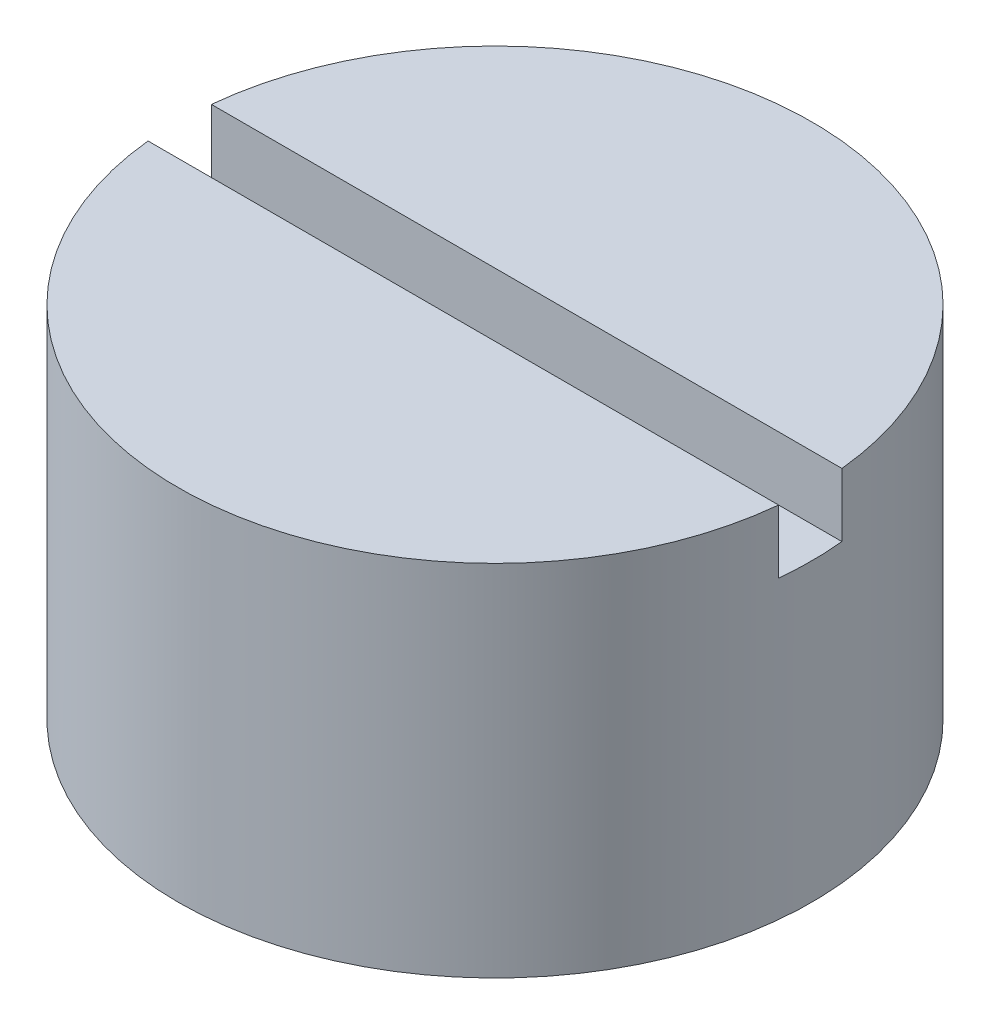
ISO-10303-21;
HEADER;
FILE_DESCRIPTION(('STEP AP214'),'2;1');
FILE_NAME('part.step','',(''),(''),'','','');
FILE_SCHEMA(('AUTOMOTIVE_DESIGN { 1 0 10303 214 1 1 1 1 }'));
ENDSEC;
DATA;
#1=APPLICATION_CONTEXT('core data for automotive mechanical design processes');
#2=APPLICATION_PROTOCOL_DEFINITION('international standard','automotive_design',2000,#1);
#3=PRODUCT_CONTEXT('',#1,'mechanical');
#4=PRODUCT('Part','Part','',(#3));
#5=PRODUCT_RELATED_PRODUCT_CATEGORY('part','',(#4));
#6=PRODUCT_DEFINITION_FORMATION('','',#4);
#7=PRODUCT_DEFINITION_CONTEXT('part definition',#1,'design');
#8=PRODUCT_DEFINITION('design','',#6,#7);
#9=PRODUCT_DEFINITION_SHAPE('','',#8);
#10=(LENGTH_UNIT() NAMED_UNIT(*) SI_UNIT(.MILLI.,.METRE.));
#11=(NAMED_UNIT(*) PLANE_ANGLE_UNIT() SI_UNIT($,.RADIAN.));
#12=(NAMED_UNIT(*) SI_UNIT($,.STERADIAN.) SOLID_ANGLE_UNIT());
#13=UNCERTAINTY_MEASURE_WITH_UNIT(LENGTH_MEASURE(1.E-05),#10,'distance_accuracy_value','');
#14=(GEOMETRIC_REPRESENTATION_CONTEXT(3) GLOBAL_UNCERTAINTY_ASSIGNED_CONTEXT((#13)) GLOBAL_UNIT_ASSIGNED_CONTEXT((#10,
#11,#12)) REPRESENTATION_CONTEXT('',''));
#15=CARTESIAN_POINT('',(0.,0.,0.));
#16=DIRECTION('',(0.,0.,1.));
#17=DIRECTION('',(1.,0.,0.));
#18=AXIS2_PLACEMENT_3D('',#15,#16,#17);
#19=CARTESIAN_POINT('',(0.,11.,0.));
#20=DIRECTION('',(0.,1.,0.));
#21=DIRECTION('',(0.,0.,1.));
#22=AXIS2_PLACEMENT_3D('',#19,#20,#21);
#23=PLANE('',#22);
#24=DIRECTION('',(-1.,0.,0.));
#25=VECTOR('',#24,1.);
#26=CARTESIAN_POINT('',(0.,11.,-1.5));
#27=LINE('',#26,#25);
#28=CARTESIAN_POINT('',(14.9248115565993,11.,-1.5));
#29=VERTEX_POINT('',#28);
#30=CARTESIAN_POINT('',(-14.9248115565993,11.,-1.5));
#31=VERTEX_POINT('',#30);
#32=EDGE_CURVE('E117',#29,#31,#27,.T.);
#33=ORIENTED_EDGE('',*,*,#32,.F.);
#34=CARTESIAN_POINT('',(0.,11.,0.));
#35=DIRECTION('',(0.,1.,0.));
#36=DIRECTION('',(0.,0.,1.));
#37=AXIS2_PLACEMENT_3D('',#34,#35,#36);
#38=CIRCLE('',#37,15.);
#39=EDGE_CURVE('E129',#29,#31,#38,.T.);
#40=ORIENTED_EDGE('',*,*,#39,.T.);
#41=EDGE_LOOP('',(#33,#40));
#42=FACE_BOUND('',#41,.T.);
#43=ADVANCED_FACE('F33',(#42),#23,.T.);
#44=CARTESIAN_POINT('',(0.,-6.,0.));
#45=DIRECTION('',(0.,1.,0.));
#46=DIRECTION('',(0.,0.,1.));
#47=AXIS2_PLACEMENT_3D('',#44,#45,#46);
#48=PLANE('',#47);
#49=CARTESIAN_POINT('',(0.,-6.,0.));
#50=DIRECTION('',(0.,1.,0.));
#51=DIRECTION('',(0.,0.,1.));
#52=AXIS2_PLACEMENT_3D('',#49,#50,#51);
#53=CIRCLE('',#52,15.);
#54=CARTESIAN_POINT('',(0.,-6.,15.));
#55=VERTEX_POINT('',#54);
#56=EDGE_CURVE('E118',#55,#55,#53,.T.);
#57=ORIENTED_EDGE('',*,*,#56,.F.);
#58=EDGE_LOOP('',(#57));
#59=FACE_BOUND('',#58,.T.);
#60=DIRECTION('',(-0.866025403784439,0.,-0.5));
#61=VECTOR('',#60,1.);
#62=CARTESIAN_POINT('',(11.125,-6.,-6.42302174473459));
#63=LINE('',#62,#61);
#64=CARTESIAN_POINT('',(11.125,-6.,-6.42302174473459));
#65=VERTEX_POINT('',#64);
#66=CARTESIAN_POINT('',(0.,-6.,-12.8460434894692));
#67=VERTEX_POINT('',#66);
#68=EDGE_CURVE('E56',#65,#67,#63,.T.);
#69=ORIENTED_EDGE('',*,*,#68,.T.);
#70=DIRECTION('',(-0.866025403784439,0.,0.5));
#71=VECTOR('',#70,1.);
#72=CARTESIAN_POINT('',(0.,-6.,-12.8460434894692));
#73=LINE('',#72,#71);
#74=CARTESIAN_POINT('',(-11.125,-6.,-6.42302174473459));
#75=VERTEX_POINT('',#74);
#76=EDGE_CURVE('E158',#67,#75,#73,.T.);
#77=ORIENTED_EDGE('',*,*,#76,.T.);
#78=DIRECTION('',(0.,0.,1.));
#79=VECTOR('',#78,1.);
#80=CARTESIAN_POINT('',(-11.125,-6.,-6.42302174473459));
#81=LINE('',#80,#79);
#82=CARTESIAN_POINT('',(-11.125,-6.,6.42302174473458));
#83=VERTEX_POINT('',#82);
#84=EDGE_CURVE('E161',#75,#83,#81,.T.);
#85=ORIENTED_EDGE('',*,*,#84,.T.);
#86=DIRECTION('',(0.866025403784439,0.,0.5));
#87=VECTOR('',#86,1.);
#88=CARTESIAN_POINT('',(-11.125,-6.,6.42302174473458));
#89=LINE('',#88,#87);
#90=CARTESIAN_POINT('',(0.,-6.,12.8460434894692));
#91=VERTEX_POINT('',#90);
#92=EDGE_CURVE('E164',#83,#91,#89,.T.);
#93=ORIENTED_EDGE('',*,*,#92,.T.);
#94=DIRECTION('',(0.866025403784439,0.,-0.5));
#95=VECTOR('',#94,1.);
#96=CARTESIAN_POINT('',(0.,-6.,12.8460434894692));
#97=LINE('',#96,#95);
#98=CARTESIAN_POINT('',(11.125,-6.,6.42302174473459));
#99=VERTEX_POINT('',#98);
#100=EDGE_CURVE('E167',#91,#99,#97,.T.);
#101=ORIENTED_EDGE('',*,*,#100,.T.);
#102=DIRECTION('',(0.,0.,-1.));
#103=VECTOR('',#102,1.);
#104=CARTESIAN_POINT('',(11.125,-6.,6.42302174473459));
#105=LINE('',#104,#103);
#106=EDGE_CURVE('E141',#99,#65,#105,.T.);
#107=ORIENTED_EDGE('',*,*,#106,.T.);
#108=EDGE_LOOP('',(#69,#77,#85,#93,#101,#107));
#109=FACE_BOUND('',#108,.T.);
#110=ADVANCED_FACE('F198',(#59,#109),#48,.F.);
#111=CARTESIAN_POINT('',(0.,6.,0.));
#112=DIRECTION('',(0.,-1.,0.));
#113=DIRECTION('',(0.,0.,-1.));
#114=AXIS2_PLACEMENT_3D('',#111,#112,#113);
#115=CYLINDRICAL_SURFACE('',#114,15.);
#116=ORIENTED_EDGE('',*,*,#39,.F.);
#117=DIRECTION('',(0.,-1.,0.));
#118=VECTOR('',#117,1.);
#119=CARTESIAN_POINT('',(14.9248115565993,6.,-1.5));
#120=LINE('',#119,#118);
#121=CARTESIAN_POINT('',(14.9248115565993,8.,-1.5));
#122=VERTEX_POINT('',#121);
#123=EDGE_CURVE('E130',#29,#122,#120,.T.);
#124=ORIENTED_EDGE('',*,*,#123,.T.);
#125=CARTESIAN_POINT('',(0.,8.,0.));
#126=DIRECTION('',(0.,1.,0.));
#127=DIRECTION('',(0.,0.,1.));
#128=AXIS2_PLACEMENT_3D('',#125,#126,#127);
#129=CIRCLE('',#128,15.);
#130=CARTESIAN_POINT('',(14.9248115565993,8.,1.5));
#131=VERTEX_POINT('',#130);
#132=EDGE_CURVE('E11',#131,#122,#129,.T.);
#133=ORIENTED_EDGE('',*,*,#132,.F.);
#134=DIRECTION('',(0.,-1.,0.));
#135=VECTOR('',#134,1.);
#136=CARTESIAN_POINT('',(14.9248115565993,6.,1.5));
#137=LINE('',#136,#135);
#138=CARTESIAN_POINT('',(14.9248115565993,11.,1.5));
#139=VERTEX_POINT('',#138);
#140=EDGE_CURVE('E112',#131,#139,#137,.F.);
#141=ORIENTED_EDGE('',*,*,#140,.T.);
#142=CARTESIAN_POINT('',(-14.9248115565993,11.,1.5));
#143=VERTEX_POINT('',#142);
#144=EDGE_CURVE('E124',#143,#139,#38,.T.);
#145=ORIENTED_EDGE('',*,*,#144,.F.);
#146=DIRECTION('',(0.,-1.,0.));
#147=VECTOR('',#146,1.);
#148=CARTESIAN_POINT('',(-14.9248115565993,6.,1.5));
#149=LINE('',#148,#147);
#150=CARTESIAN_POINT('',(-14.9248115565993,8.,1.5));
#151=VERTEX_POINT('',#150);
#152=EDGE_CURVE('E48',#143,#151,#149,.T.);
#153=ORIENTED_EDGE('',*,*,#152,.T.);
#154=CARTESIAN_POINT('',(-14.9248115565993,8.,-1.5));
#155=VERTEX_POINT('',#154);
#156=EDGE_CURVE('E37',#155,#151,#129,.T.);
#157=ORIENTED_EDGE('',*,*,#156,.F.);
#158=DIRECTION('',(0.,-1.,0.));
#159=VECTOR('',#158,1.);
#160=CARTESIAN_POINT('',(-14.9248115565993,6.,-1.5));
#161=LINE('',#160,#159);
#162=EDGE_CURVE('E133',#155,#31,#161,.F.);
#163=ORIENTED_EDGE('',*,*,#162,.T.);
#164=EDGE_LOOP('',(#116,#124,#133,#141,#145,#153,#157,#163));
#165=FACE_BOUND('',#164,.T.);
#166=ORIENTED_EDGE('',*,*,#56,.T.);
#167=EDGE_LOOP('',(#166));
#168=FACE_BOUND('',#167,.T.);
#169=ADVANCED_FACE('F35',(#165,#168),#115,.T.);
#170=CARTESIAN_POINT('',(11.125,6.,-6.42302174473459));
#171=DIRECTION('',(-0.5,0.,0.866025403784439));
#172=DIRECTION('',(0.866025403784439,0.,0.5));
#173=AXIS2_PLACEMENT_3D('',#170,#171,#172);
#174=PLANE('',#173);
#175=ORIENTED_EDGE('',*,*,#68,.F.);
#176=DIRECTION('',(0.,-1.,0.));
#177=VECTOR('',#176,1.);
#178=CARTESIAN_POINT('',(11.125,6.,-6.42302174473459));
#179=LINE('',#178,#177);
#180=CARTESIAN_POINT('',(11.125,6.,-6.42302174473459));
#181=VERTEX_POINT('',#180);
#182=EDGE_CURVE('E156',#181,#65,#179,.T.);
#183=ORIENTED_EDGE('',*,*,#182,.F.);
#184=DIRECTION('',(-0.866025403784439,0.,-0.5));
#185=VECTOR('',#184,1.);
#186=CARTESIAN_POINT('',(11.125,6.,-6.42302174473459));
#187=LINE('',#186,#185);
#188=CARTESIAN_POINT('',(0.,6.,-12.8460434894692));
#189=VERTEX_POINT('',#188);
#190=EDGE_CURVE('E137',#181,#189,#187,.T.);
#191=ORIENTED_EDGE('',*,*,#190,.T.);
#192=DIRECTION('',(0.,-1.,0.));
#193=VECTOR('',#192,1.);
#194=CARTESIAN_POINT('',(0.,6.,-12.8460434894692));
#195=LINE('',#194,#193);
#196=EDGE_CURVE('E181',#189,#67,#195,.T.);
#197=ORIENTED_EDGE('',*,*,#196,.T.);
#198=EDGE_LOOP('',(#175,#183,#191,#197));
#199=FACE_BOUND('',#198,.T.);
#200=ADVANCED_FACE('F237',(#199),#174,.T.);
#201=CARTESIAN_POINT('',(0.,6.,-12.8460434894692));
#202=DIRECTION('',(0.5,0.,0.866025403784439));
#203=DIRECTION('',(0.866025403784439,0.,-0.5));
#204=AXIS2_PLACEMENT_3D('',#201,#202,#203);
#205=PLANE('',#204);
#206=ORIENTED_EDGE('',*,*,#76,.F.);
#207=ORIENTED_EDGE('',*,*,#196,.F.);
#208=DIRECTION('',(-0.866025403784439,0.,0.5));
#209=VECTOR('',#208,1.);
#210=CARTESIAN_POINT('',(0.,6.,-12.8460434894692));
#211=LINE('',#210,#209);
#212=CARTESIAN_POINT('',(-11.125,6.,-6.42302174473459));
#213=VERTEX_POINT('',#212);
#214=EDGE_CURVE('E140',#189,#213,#211,.T.);
#215=ORIENTED_EDGE('',*,*,#214,.T.);
#216=DIRECTION('',(0.,-1.,0.));
#217=VECTOR('',#216,1.);
#218=CARTESIAN_POINT('',(-11.125,6.,-6.42302174473459));
#219=LINE('',#218,#217);
#220=EDGE_CURVE('E179',#213,#75,#219,.T.);
#221=ORIENTED_EDGE('',*,*,#220,.T.);
#222=EDGE_LOOP('',(#206,#207,#215,#221));
#223=FACE_BOUND('',#222,.T.);
#224=ADVANCED_FACE('F233',(#223),#205,.T.);
#225=CARTESIAN_POINT('',(-11.125,6.,-6.42302174473459));
#226=DIRECTION('',(1.,0.,0.));
#227=DIRECTION('',(0.,0.,-1.));
#228=AXIS2_PLACEMENT_3D('',#225,#226,#227);
#229=PLANE('',#228);
#230=ORIENTED_EDGE('',*,*,#84,.F.);
#231=ORIENTED_EDGE('',*,*,#220,.F.);
#232=DIRECTION('',(0.,0.,1.));
#233=VECTOR('',#232,1.);
#234=CARTESIAN_POINT('',(-11.125,6.,-6.42302174473459));
#235=LINE('',#234,#233);
#236=CARTESIAN_POINT('',(-11.125,6.,6.42302174473458));
#237=VERTEX_POINT('',#236);
#238=EDGE_CURVE('E144',#213,#237,#235,.T.);
#239=ORIENTED_EDGE('',*,*,#238,.T.);
#240=DIRECTION('',(0.,-1.,0.));
#241=VECTOR('',#240,1.);
#242=CARTESIAN_POINT('',(-11.125,6.,6.42302174473458));
#243=LINE('',#242,#241);
#244=EDGE_CURVE('E177',#237,#83,#243,.T.);
#245=ORIENTED_EDGE('',*,*,#244,.T.);
#246=EDGE_LOOP('',(#230,#231,#239,#245));
#247=FACE_BOUND('',#246,.T.);
#248=ADVANCED_FACE('F229',(#247),#229,.T.);
#249=CARTESIAN_POINT('',(-11.125,6.,6.42302174473458));
#250=DIRECTION('',(0.5,0.,-0.866025403784439));
#251=DIRECTION('',(-0.866025403784439,0.,-0.5));
#252=AXIS2_PLACEMENT_3D('',#249,#250,#251);
#253=PLANE('',#252);
#254=ORIENTED_EDGE('',*,*,#92,.F.);
#255=ORIENTED_EDGE('',*,*,#244,.F.);
#256=DIRECTION('',(0.866025403784439,0.,0.5));
#257=VECTOR('',#256,1.);
#258=CARTESIAN_POINT('',(-11.125,6.,6.42302174473458));
#259=LINE('',#258,#257);
#260=CARTESIAN_POINT('',(0.,6.,12.8460434894692));
#261=VERTEX_POINT('',#260);
#262=EDGE_CURVE('E147',#237,#261,#259,.T.);
#263=ORIENTED_EDGE('',*,*,#262,.T.);
#264=DIRECTION('',(0.,-1.,0.));
#265=VECTOR('',#264,1.);
#266=CARTESIAN_POINT('',(0.,6.,12.8460434894692));
#267=LINE('',#266,#265);
#268=EDGE_CURVE('E175',#261,#91,#267,.T.);
#269=ORIENTED_EDGE('',*,*,#268,.T.);
#270=EDGE_LOOP('',(#254,#255,#263,#269));
#271=FACE_BOUND('',#270,.T.);
#272=ADVANCED_FACE('F225',(#271),#253,.T.);
#273=CARTESIAN_POINT('',(0.,6.,12.8460434894692));
#274=DIRECTION('',(-0.5,0.,-0.866025403784439));
#275=DIRECTION('',(-0.866025403784439,0.,0.5));
#276=AXIS2_PLACEMENT_3D('',#273,#274,#275);
#277=PLANE('',#276);
#278=ORIENTED_EDGE('',*,*,#100,.F.);
#279=ORIENTED_EDGE('',*,*,#268,.F.);
#280=DIRECTION('',(0.866025403784439,0.,-0.5));
#281=VECTOR('',#280,1.);
#282=CARTESIAN_POINT('',(0.,6.,12.8460434894692));
#283=LINE('',#282,#281);
#284=CARTESIAN_POINT('',(11.125,6.,6.42302174473459));
#285=VERTEX_POINT('',#284);
#286=EDGE_CURVE('E150',#261,#285,#283,.T.);
#287=ORIENTED_EDGE('',*,*,#286,.T.);
#288=DIRECTION('',(0.,-1.,0.));
#289=VECTOR('',#288,1.);
#290=CARTESIAN_POINT('',(11.125,6.,6.42302174473459));
#291=LINE('',#290,#289);
#292=EDGE_CURVE('E173',#285,#99,#291,.T.);
#293=ORIENTED_EDGE('',*,*,#292,.T.);
#294=EDGE_LOOP('',(#278,#279,#287,#293));
#295=FACE_BOUND('',#294,.T.);
#296=ADVANCED_FACE('F219',(#295),#277,.T.);
#297=CARTESIAN_POINT('',(11.125,6.,6.42302174473459));
#298=DIRECTION('',(-1.,0.,0.));
#299=DIRECTION('',(0.,0.,1.));
#300=AXIS2_PLACEMENT_3D('',#297,#298,#299);
#301=PLANE('',#300);
#302=ORIENTED_EDGE('',*,*,#106,.F.);
#303=ORIENTED_EDGE('',*,*,#292,.F.);
#304=DIRECTION('',(0.,0.,-1.));
#305=VECTOR('',#304,1.);
#306=CARTESIAN_POINT('',(11.125,6.,6.42302174473459));
#307=LINE('',#306,#305);
#308=EDGE_CURVE('E153',#285,#181,#307,.T.);
#309=ORIENTED_EDGE('',*,*,#308,.T.);
#310=ORIENTED_EDGE('',*,*,#182,.T.);
#311=EDGE_LOOP('',(#302,#303,#309,#310));
#312=FACE_BOUND('',#311,.T.);
#313=ADVANCED_FACE('F214',(#312),#301,.T.);
#314=CARTESIAN_POINT('',(0.,6.,0.));
#315=DIRECTION('',(0.,1.,0.));
#316=DIRECTION('',(0.,0.,1.));
#317=AXIS2_PLACEMENT_3D('',#314,#315,#316);
#318=PLANE('',#317);
#319=ORIENTED_EDGE('',*,*,#214,.F.);
#320=ORIENTED_EDGE('',*,*,#190,.F.);
#321=ORIENTED_EDGE('',*,*,#308,.F.);
#322=ORIENTED_EDGE('',*,*,#286,.F.);
#323=ORIENTED_EDGE('',*,*,#262,.F.);
#324=ORIENTED_EDGE('',*,*,#238,.F.);
#325=EDGE_LOOP('',(#319,#320,#321,#322,#323,#324));
#326=FACE_BOUND('',#325,.T.);
#327=ADVANCED_FACE('F207',(#326),#318,.F.);
#328=DIRECTION('',(1.,0.,0.));
#329=VECTOR('',#328,1.);
#330=CARTESIAN_POINT('',(0.,11.,1.5));
#331=LINE('',#330,#329);
#332=EDGE_CURVE('E109',#143,#139,#331,.T.);
#333=ORIENTED_EDGE('',*,*,#332,.F.);
#334=ORIENTED_EDGE('',*,*,#144,.T.);
#335=EDGE_LOOP('',(#333,#334));
#336=FACE_BOUND('',#335,.T.);
#337=ADVANCED_FACE('F128',(#336),#23,.T.);
#338=CARTESIAN_POINT('',(0.,8.,0.));
#339=DIRECTION('',(0.,1.,0.));
#340=DIRECTION('',(0.,0.,1.));
#341=AXIS2_PLACEMENT_3D('',#338,#339,#340);
#342=PLANE('',#341);
#343=ORIENTED_EDGE('',*,*,#132,.T.);
#344=DIRECTION('',(-1.,0.,0.));
#345=VECTOR('',#344,1.);
#346=CARTESIAN_POINT('',(16.,8.,-1.5));
#347=LINE('',#346,#345);
#348=EDGE_CURVE('E126',#122,#155,#347,.T.);
#349=ORIENTED_EDGE('',*,*,#348,.T.);
#350=ORIENTED_EDGE('',*,*,#156,.T.);
#351=DIRECTION('',(1.,0.,0.));
#352=VECTOR('',#351,1.);
#353=CARTESIAN_POINT('',(16.,8.,1.5));
#354=LINE('',#353,#352);
#355=EDGE_CURVE('E191',#151,#131,#354,.T.);
#356=ORIENTED_EDGE('',*,*,#355,.T.);
#357=EDGE_LOOP('',(#343,#349,#350,#356));
#358=FACE_BOUND('',#357,.T.);
#359=ADVANCED_FACE('F190',(#358),#342,.T.);
#360=CARTESIAN_POINT('',(16.,8.,-1.5));
#361=DIRECTION('',(0.,0.,-1.));
#362=DIRECTION('',(-1.,0.,0.));
#363=AXIS2_PLACEMENT_3D('',#360,#361,#362);
#364=PLANE('',#363);
#365=ORIENTED_EDGE('',*,*,#32,.T.);
#366=ORIENTED_EDGE('',*,*,#162,.F.);
#367=ORIENTED_EDGE('',*,*,#348,.F.);
#368=ORIENTED_EDGE('',*,*,#123,.F.);
#369=EDGE_LOOP('',(#365,#366,#367,#368));
#370=FACE_BOUND('',#369,.T.);
#371=ADVANCED_FACE('F212',(#370),#364,.F.);
#372=CARTESIAN_POINT('',(16.,8.,1.5));
#373=DIRECTION('',(0.,0.,1.));
#374=DIRECTION('',(1.,0.,0.));
#375=AXIS2_PLACEMENT_3D('',#372,#373,#374);
#376=PLANE('',#375);
#377=ORIENTED_EDGE('',*,*,#332,.T.);
#378=ORIENTED_EDGE('',*,*,#140,.F.);
#379=ORIENTED_EDGE('',*,*,#355,.F.);
#380=ORIENTED_EDGE('',*,*,#152,.F.);
#381=EDGE_LOOP('',(#377,#378,#379,#380));
#382=FACE_BOUND('',#381,.T.);
#383=ADVANCED_FACE('F111',(#382),#376,.F.);
#384=CLOSED_SHELL('',(#43,#110,#169,#200,#224,#248,#272,#296,#313,#327,#337,#359,#371,#383));
#385=MANIFOLD_SOLID_BREP('B2',#384);
#386=ADVANCED_BREP_SHAPE_REPRESENTATION('',(#18,#385),#14);
#387=SHAPE_DEFINITION_REPRESENTATION(#9,#386);
ENDSEC;
END-ISO-10303-21;
